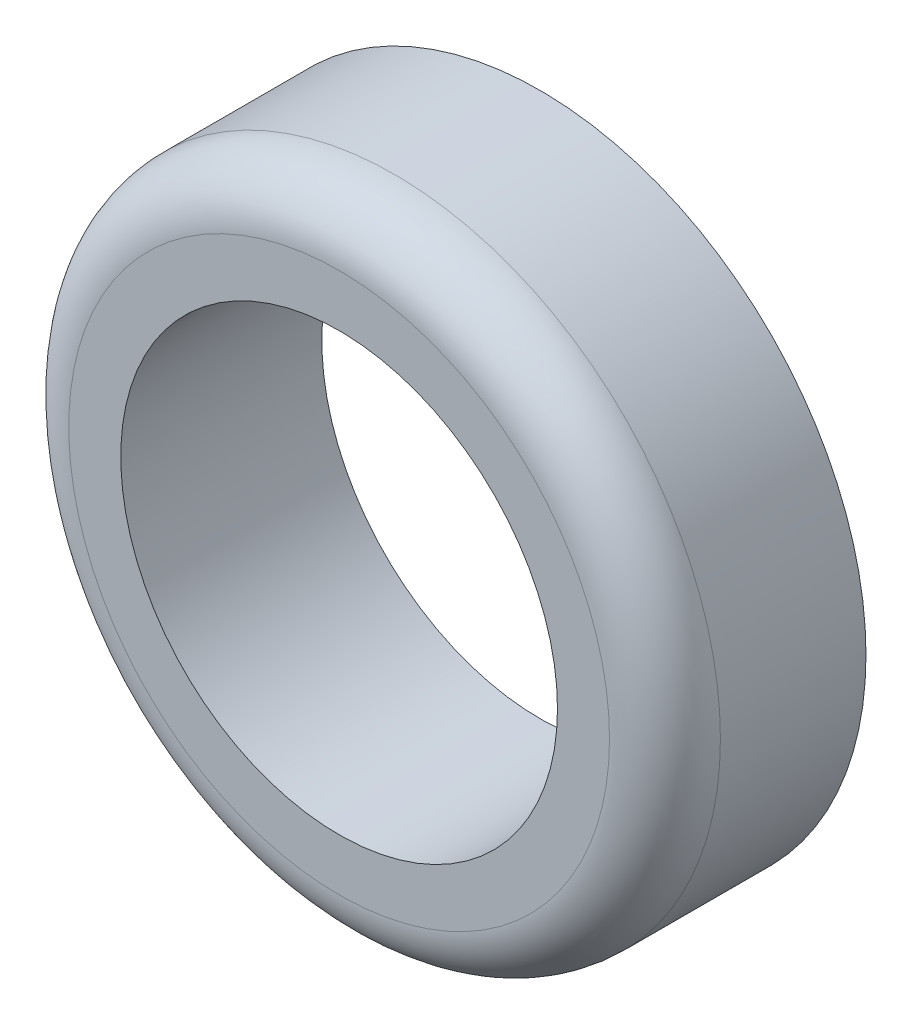
ISO-10303-21;
HEADER;
FILE_DESCRIPTION(('STEP AP214'),'2;1');
FILE_NAME('part.step','',(''),(''),'','','');
FILE_SCHEMA(('AUTOMOTIVE_DESIGN { 1 0 10303 214 1 1 1 1 }'));
ENDSEC;
DATA;
#1=APPLICATION_CONTEXT('core data for automotive mechanical design processes');
#2=APPLICATION_PROTOCOL_DEFINITION('international standard','automotive_design',2000,#1);
#3=PRODUCT_CONTEXT('',#1,'mechanical');
#4=PRODUCT('Part','Part','',(#3));
#5=PRODUCT_RELATED_PRODUCT_CATEGORY('part','',(#4));
#6=PRODUCT_DEFINITION_FORMATION('','',#4);
#7=PRODUCT_DEFINITION_CONTEXT('part definition',#1,'design');
#8=PRODUCT_DEFINITION('design','',#6,#7);
#9=PRODUCT_DEFINITION_SHAPE('','',#8);
#10=(LENGTH_UNIT() NAMED_UNIT(*) SI_UNIT(.MILLI.,.METRE.));
#11=(NAMED_UNIT(*) PLANE_ANGLE_UNIT() SI_UNIT($,.RADIAN.));
#12=(NAMED_UNIT(*) SI_UNIT($,.STERADIAN.) SOLID_ANGLE_UNIT());
#13=UNCERTAINTY_MEASURE_WITH_UNIT(LENGTH_MEASURE(1.E-05),#10,'distance_accuracy_value','');
#14=(GEOMETRIC_REPRESENTATION_CONTEXT(3) GLOBAL_UNCERTAINTY_ASSIGNED_CONTEXT((#13)) GLOBAL_UNIT_ASSIGNED_CONTEXT((#10,
#11,#12)) REPRESENTATION_CONTEXT('',''));
#15=CARTESIAN_POINT('',(0.,0.,0.));
#16=DIRECTION('',(0.,0.,1.));
#17=DIRECTION('',(1.,0.,0.));
#18=AXIS2_PLACEMENT_3D('',#15,#16,#17);
#19=CARTESIAN_POINT('',(0.,0.,29.));
#20=DIRECTION('',(0.,0.,1.));
#21=DIRECTION('',(1.,0.,0.));
#22=AXIS2_PLACEMENT_3D('',#19,#20,#21);
#23=PLANE('',#22);
#24=CARTESIAN_POINT('',(0.,0.,29.));
#25=DIRECTION('',(0.,0.,1.));
#26=DIRECTION('',(1.,0.,0.));
#27=AXIS2_PLACEMENT_3D('',#24,#25,#26);
#28=CIRCLE('',#27,39.005);
#29=CARTESIAN_POINT('',(39.005,0.,29.));
#30=VERTEX_POINT('',#29);
#31=EDGE_CURVE('E42',#30,#30,#28,.T.);
#32=ORIENTED_EDGE('',*,*,#31,.T.);
#33=EDGE_LOOP('',(#32));
#34=FACE_BOUND('',#33,.T.);
#35=CARTESIAN_POINT('',(0.,0.,29.));
#36=DIRECTION('',(0.,0.,1.));
#37=DIRECTION('',(1.,0.,0.));
#38=AXIS2_PLACEMENT_3D('',#35,#36,#37);
#39=CIRCLE('',#38,31.5);
#40=CARTESIAN_POINT('',(31.5,0.,29.));
#41=VERTEX_POINT('',#40);
#42=EDGE_CURVE('E50',#41,#41,#39,.T.);
#43=ORIENTED_EDGE('',*,*,#42,.F.);
#44=EDGE_LOOP('',(#43));
#45=FACE_BOUND('',#44,.T.);
#46=ADVANCED_FACE('F35',(#34,#45),#23,.T.);
#47=CARTESIAN_POINT('',(0.,0.,0.));
#48=DIRECTION('',(0.,0.,1.));
#49=DIRECTION('',(1.,0.,0.));
#50=AXIS2_PLACEMENT_3D('',#47,#48,#49);
#51=PLANE('',#50);
#52=CARTESIAN_POINT('',(0.,0.,0.));
#53=DIRECTION('',(0.,0.,1.));
#54=DIRECTION('',(1.,0.,0.));
#55=AXIS2_PLACEMENT_3D('',#52,#53,#54);
#56=CIRCLE('',#55,47.005);
#57=CARTESIAN_POINT('',(47.005,0.,0.));
#58=VERTEX_POINT('',#57);
#59=EDGE_CURVE('E46',#58,#58,#56,.T.);
#60=ORIENTED_EDGE('',*,*,#59,.F.);
#61=EDGE_LOOP('',(#60));
#62=FACE_BOUND('',#61,.T.);
#63=CARTESIAN_POINT('',(0.,0.,0.));
#64=DIRECTION('',(0.,0.,1.));
#65=DIRECTION('',(1.,0.,0.));
#66=AXIS2_PLACEMENT_3D('',#63,#64,#65);
#67=CIRCLE('',#66,31.5);
#68=CARTESIAN_POINT('',(31.5,0.,0.));
#69=VERTEX_POINT('',#68);
#70=EDGE_CURVE('E53',#69,#69,#67,.T.);
#71=ORIENTED_EDGE('',*,*,#70,.T.);
#72=EDGE_LOOP('',(#71));
#73=FACE_BOUND('',#72,.T.);
#74=ADVANCED_FACE('F63',(#62,#73),#51,.F.);
#75=CARTESIAN_POINT('',(0.,0.,29.));
#76=DIRECTION('',(0.,0.,-1.));
#77=DIRECTION('',(-1.,0.,0.));
#78=AXIS2_PLACEMENT_3D('',#75,#76,#77);
#79=CYLINDRICAL_SURFACE('',#78,47.005);
#80=CARTESIAN_POINT('',(0.,0.,21.));
#81=DIRECTION('',(0.,0.,1.));
#82=DIRECTION('',(1.,0.,0.));
#83=AXIS2_PLACEMENT_3D('',#80,#81,#82);
#84=CIRCLE('',#83,47.005);
#85=CARTESIAN_POINT('',(47.005,0.,21.));
#86=VERTEX_POINT('',#85);
#87=EDGE_CURVE('E10',#86,#86,#84,.F.);
#88=ORIENTED_EDGE('',*,*,#87,.T.);
#89=EDGE_LOOP('',(#88));
#90=FACE_BOUND('',#89,.T.);
#91=ORIENTED_EDGE('',*,*,#59,.T.);
#92=EDGE_LOOP('',(#91));
#93=FACE_BOUND('',#92,.T.);
#94=ADVANCED_FACE('F68',(#90,#93),#79,.T.);
#95=CARTESIAN_POINT('',(0.,0.,29.));
#96=DIRECTION('',(0.,0.,-1.));
#97=DIRECTION('',(-1.,0.,0.));
#98=AXIS2_PLACEMENT_3D('',#95,#96,#97);
#99=CYLINDRICAL_SURFACE('',#98,31.5);
#100=ORIENTED_EDGE('',*,*,#42,.T.);
#101=EDGE_LOOP('',(#100));
#102=FACE_BOUND('',#101,.T.);
#103=ORIENTED_EDGE('',*,*,#70,.F.);
#104=EDGE_LOOP('',(#103));
#105=FACE_BOUND('',#104,.T.);
#106=ADVANCED_FACE('F59',(#102,#105),#99,.F.);
#107=CARTESIAN_POINT('',(0.,0.,21.));
#108=DIRECTION('',(0.,0.,1.));
#109=DIRECTION('',(1.,0.,0.));
#110=AXIS2_PLACEMENT_3D('',#107,#108,#109);
#111=TOROIDAL_SURFACE('',#110,39.005,8.);
#112=ORIENTED_EDGE('',*,*,#87,.F.);
#113=EDGE_LOOP('',(#112));
#114=FACE_BOUND('',#113,.T.);
#115=ORIENTED_EDGE('',*,*,#31,.F.);
#116=EDGE_LOOP('',(#115));
#117=FACE_BOUND('',#116,.T.);
#118=ADVANCED_FACE('F37',(#114,#117),#111,.T.);
#119=CLOSED_SHELL('',(#46,#74,#94,#106,#118));
#120=MANIFOLD_SOLID_BREP('B2',#119);
#121=ADVANCED_BREP_SHAPE_REPRESENTATION('',(#18,#120),#14);
#122=SHAPE_DEFINITION_REPRESENTATION(#9,#121);
ENDSEC;
END-ISO-10303-21;
